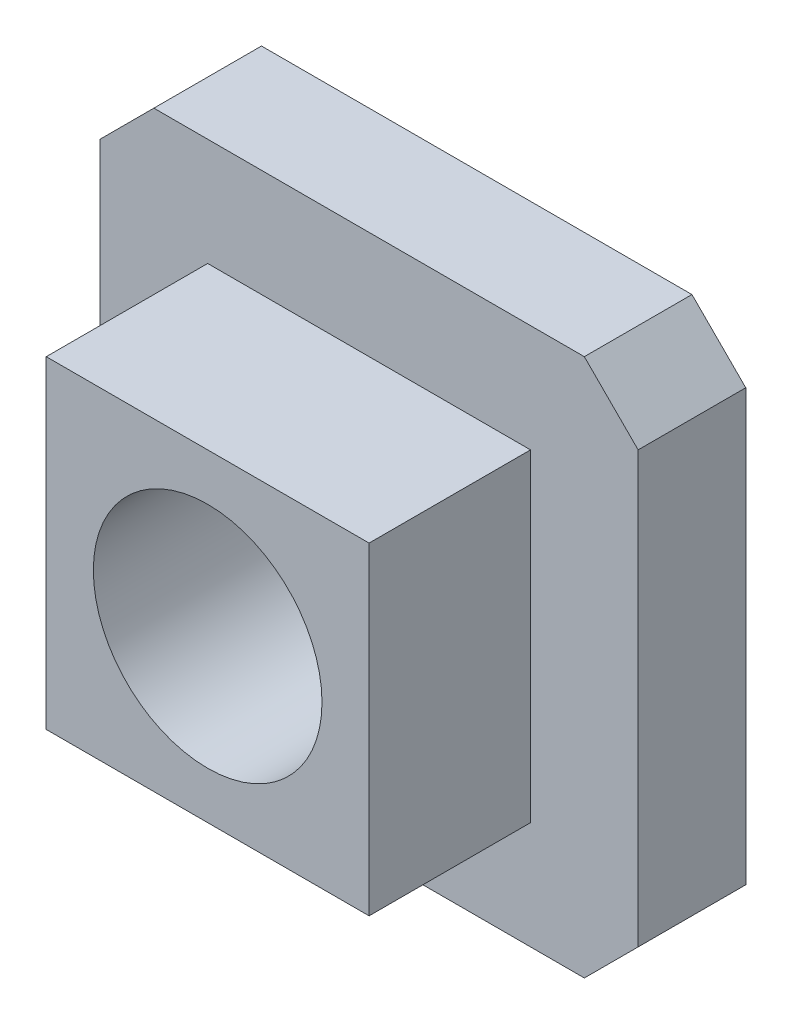
ISO-10303-21;
HEADER;
FILE_DESCRIPTION(('STEP AP214'),'2;1');
FILE_NAME('part.step','',(''),(''),'','','');
FILE_SCHEMA(('AUTOMOTIVE_DESIGN { 1 0 10303 214 1 1 1 1 }'));
ENDSEC;
DATA;
#1=APPLICATION_CONTEXT('core data for automotive mechanical design processes');
#2=APPLICATION_PROTOCOL_DEFINITION('international standard','automotive_design',2000,#1);
#3=PRODUCT_CONTEXT('',#1,'mechanical');
#4=PRODUCT('Part','Part','',(#3));
#5=PRODUCT_RELATED_PRODUCT_CATEGORY('part','',(#4));
#6=PRODUCT_DEFINITION_FORMATION('','',#4);
#7=PRODUCT_DEFINITION_CONTEXT('part definition',#1,'design');
#8=PRODUCT_DEFINITION('design','',#6,#7);
#9=PRODUCT_DEFINITION_SHAPE('','',#8);
#10=(LENGTH_UNIT() NAMED_UNIT(*) SI_UNIT(.MILLI.,.METRE.));
#11=(NAMED_UNIT(*) PLANE_ANGLE_UNIT() SI_UNIT($,.RADIAN.));
#12=(NAMED_UNIT(*) SI_UNIT($,.STERADIAN.) SOLID_ANGLE_UNIT());
#13=UNCERTAINTY_MEASURE_WITH_UNIT(LENGTH_MEASURE(1.E-05),#10,'distance_accuracy_value','');
#14=(GEOMETRIC_REPRESENTATION_CONTEXT(3) GLOBAL_UNCERTAINTY_ASSIGNED_CONTEXT((#13)) GLOBAL_UNIT_ASSIGNED_CONTEXT((#10,
#11,#12)) REPRESENTATION_CONTEXT('',''));
#15=CARTESIAN_POINT('',(0.,0.,0.));
#16=DIRECTION('',(0.,0.,1.));
#17=DIRECTION('',(1.,0.,0.));
#18=AXIS2_PLACEMENT_3D('',#15,#16,#17);
#19=CARTESIAN_POINT('',(0.,0.,3.175));
#20=DIRECTION('',(0.,0.,1.));
#21=DIRECTION('',(1.,0.,0.));
#22=AXIS2_PLACEMENT_3D('',#19,#20,#21);
#23=PLANE('',#22);
#24=DIRECTION('',(0.,1.,0.));
#25=VECTOR('',#24,1.);
#26=CARTESIAN_POINT('',(15.875,-15.875,3.175));
#27=LINE('',#26,#25);
#28=CARTESIAN_POINT('',(15.875,-12.7,3.175));
#29=VERTEX_POINT('',#28);
#30=CARTESIAN_POINT('',(15.875,12.7,3.175));
#31=VERTEX_POINT('',#30);
#32=EDGE_CURVE('E165',#29,#31,#27,.T.);
#33=ORIENTED_EDGE('',*,*,#32,.T.);
#34=DIRECTION('',(0.707106781186547,-0.707106781186548,0.));
#35=VECTOR('',#34,1.);
#36=CARTESIAN_POINT('',(14.2875,14.2875,3.175));
#37=LINE('',#36,#35);
#38=CARTESIAN_POINT('',(12.7,15.875,3.175));
#39=VERTEX_POINT('',#38);
#40=EDGE_CURVE('E200',#31,#39,#37,.F.);
#41=ORIENTED_EDGE('',*,*,#40,.T.);
#42=DIRECTION('',(-1.,0.,0.));
#43=VECTOR('',#42,1.);
#44=CARTESIAN_POINT('',(15.875,15.875,3.175));
#45=LINE('',#44,#43);
#46=CARTESIAN_POINT('',(-12.7,15.875,3.175));
#47=VERTEX_POINT('',#46);
#48=EDGE_CURVE('E168',#39,#47,#45,.T.);
#49=ORIENTED_EDGE('',*,*,#48,.T.);
#50=DIRECTION('',(0.707106781186548,0.707106781186547,0.));
#51=VECTOR('',#50,1.);
#52=CARTESIAN_POINT('',(-14.2875,14.2875,3.175));
#53=LINE('',#52,#51);
#54=CARTESIAN_POINT('',(-15.875,12.7,3.175));
#55=VERTEX_POINT('',#54);
#56=EDGE_CURVE('E198',#47,#55,#53,.F.);
#57=ORIENTED_EDGE('',*,*,#56,.T.);
#58=DIRECTION('',(0.,-1.,0.));
#59=VECTOR('',#58,1.);
#60=CARTESIAN_POINT('',(-15.875,-15.875,3.175));
#61=LINE('',#60,#59);
#62=CARTESIAN_POINT('',(-15.875,-12.7,3.175));
#63=VERTEX_POINT('',#62);
#64=EDGE_CURVE('E160',#55,#63,#61,.T.);
#65=ORIENTED_EDGE('',*,*,#64,.T.);
#66=DIRECTION('',(-0.707106781186546,0.707106781186549,0.));
#67=VECTOR('',#66,1.);
#68=CARTESIAN_POINT('',(-14.2875,-14.2875,3.175));
#69=LINE('',#68,#67);
#70=CARTESIAN_POINT('',(-12.7,-15.875,3.175));
#71=VERTEX_POINT('',#70);
#72=EDGE_CURVE('E57',#63,#71,#69,.F.);
#73=ORIENTED_EDGE('',*,*,#72,.T.);
#74=DIRECTION('',(1.,0.,0.));
#75=VECTOR('',#74,1.);
#76=CARTESIAN_POINT('',(15.875,-15.875,3.175));
#77=LINE('',#76,#75);
#78=CARTESIAN_POINT('',(12.7,-15.875,3.175));
#79=VERTEX_POINT('',#78);
#80=EDGE_CURVE('E162',#71,#79,#77,.T.);
#81=ORIENTED_EDGE('',*,*,#80,.T.);
#82=DIRECTION('',(-0.707106781186548,-0.707106781186547,0.));
#83=VECTOR('',#82,1.);
#84=CARTESIAN_POINT('',(14.2875,-14.2875,3.175));
#85=LINE('',#84,#83);
#86=EDGE_CURVE('E195',#79,#29,#85,.F.);
#87=ORIENTED_EDGE('',*,*,#86,.T.);
#88=EDGE_LOOP('',(#33,#41,#49,#57,#65,#73,#81,#87));
#89=FACE_BOUND('',#88,.T.);
#90=DIRECTION('',(1.,0.,0.));
#91=VECTOR('',#90,1.);
#92=CARTESIAN_POINT('',(9.525,-9.525,3.175));
#93=LINE('',#92,#91);
#94=CARTESIAN_POINT('',(-9.525,-9.525,3.175));
#95=VERTEX_POINT('',#94);
#96=CARTESIAN_POINT('',(9.525,-9.525,3.175));
#97=VERTEX_POINT('',#96);
#98=EDGE_CURVE('E390',#95,#97,#93,.T.);
#99=ORIENTED_EDGE('',*,*,#98,.F.);
#100=DIRECTION('',(0.,-1.,0.));
#101=VECTOR('',#100,1.);
#102=CARTESIAN_POINT('',(-9.525,-9.525,3.175));
#103=LINE('',#102,#101);
#104=CARTESIAN_POINT('',(-9.525,9.525,3.175));
#105=VERTEX_POINT('',#104);
#106=EDGE_CURVE('E149',#105,#95,#103,.T.);
#107=ORIENTED_EDGE('',*,*,#106,.F.);
#108=DIRECTION('',(-1.,0.,0.));
#109=VECTOR('',#108,1.);
#110=CARTESIAN_POINT('',(9.525,9.525,3.175));
#111=LINE('',#110,#109);
#112=CARTESIAN_POINT('',(9.525,9.525,3.175));
#113=VERTEX_POINT('',#112);
#114=EDGE_CURVE('E145',#113,#105,#111,.T.);
#115=ORIENTED_EDGE('',*,*,#114,.F.);
#116=DIRECTION('',(0.,1.,0.));
#117=VECTOR('',#116,1.);
#118=CARTESIAN_POINT('',(9.525,-9.525,3.175));
#119=LINE('',#118,#117);
#120=EDGE_CURVE('E392',#97,#113,#119,.T.);
#121=ORIENTED_EDGE('',*,*,#120,.F.);
#122=EDGE_LOOP('',(#99,#107,#115,#121));
#123=FACE_BOUND('',#122,.T.);
#124=ADVANCED_FACE('F36',(#89,#123),#23,.T.);
#125=CARTESIAN_POINT('',(-15.875,-15.875,3.175));
#126=DIRECTION('',(1.,0.,0.));
#127=DIRECTION('',(0.,0.,-1.));
#128=AXIS2_PLACEMENT_3D('',#125,#126,#127);
#129=PLANE('',#128);
#130=ORIENTED_EDGE('',*,*,#64,.F.);
#131=DIRECTION('',(0.,0.,-1.));
#132=VECTOR('',#131,1.);
#133=CARTESIAN_POINT('',(-15.875,12.7,3.175));
#134=LINE('',#133,#132);
#135=CARTESIAN_POINT('',(-15.875,12.7,-3.175));
#136=VERTEX_POINT('',#135);
#137=EDGE_CURVE('E204',#55,#136,#134,.T.);
#138=ORIENTED_EDGE('',*,*,#137,.T.);
#139=DIRECTION('',(0.,-1.,0.));
#140=VECTOR('',#139,1.);
#141=CARTESIAN_POINT('',(-15.875,-15.875,-3.175));
#142=LINE('',#141,#140);
#143=CARTESIAN_POINT('',(-15.875,-12.7,-3.175));
#144=VERTEX_POINT('',#143);
#145=EDGE_CURVE('E151',#136,#144,#142,.T.);
#146=ORIENTED_EDGE('',*,*,#145,.T.);
#147=DIRECTION('',(0.,0.,1.));
#148=VECTOR('',#147,1.);
#149=CARTESIAN_POINT('',(-15.875,-12.7,3.175));
#150=LINE('',#149,#148);
#151=EDGE_CURVE('E202',#144,#63,#150,.T.);
#152=ORIENTED_EDGE('',*,*,#151,.T.);
#153=EDGE_LOOP('',(#130,#138,#146,#152));
#154=FACE_BOUND('',#153,.T.);
#155=ADVANCED_FACE('F210',(#154),#129,.F.);
#156=CARTESIAN_POINT('',(15.875,-15.875,3.175));
#157=DIRECTION('',(0.,1.,0.));
#158=DIRECTION('',(-1.,0.,0.));
#159=AXIS2_PLACEMENT_3D('',#156,#157,#158);
#160=PLANE('',#159);
#161=ORIENTED_EDGE('',*,*,#80,.F.);
#162=DIRECTION('',(0.,0.,-1.));
#163=VECTOR('',#162,1.);
#164=CARTESIAN_POINT('',(-12.7,-15.875,3.175));
#165=LINE('',#164,#163);
#166=CARTESIAN_POINT('',(-12.7,-15.875,-3.175));
#167=VERTEX_POINT('',#166);
#168=EDGE_CURVE('E11',#71,#167,#165,.T.);
#169=ORIENTED_EDGE('',*,*,#168,.T.);
#170=DIRECTION('',(1.,0.,0.));
#171=VECTOR('',#170,1.);
#172=CARTESIAN_POINT('',(15.875,-15.875,-3.175));
#173=LINE('',#172,#171);
#174=CARTESIAN_POINT('',(12.7,-15.875,-3.175));
#175=VERTEX_POINT('',#174);
#176=EDGE_CURVE('E154',#167,#175,#173,.T.);
#177=ORIENTED_EDGE('',*,*,#176,.T.);
#178=DIRECTION('',(0.,0.,1.));
#179=VECTOR('',#178,1.);
#180=CARTESIAN_POINT('',(12.7,-15.875,3.175));
#181=LINE('',#180,#179);
#182=EDGE_CURVE('E44',#175,#79,#181,.T.);
#183=ORIENTED_EDGE('',*,*,#182,.T.);
#184=EDGE_LOOP('',(#161,#169,#177,#183));
#185=FACE_BOUND('',#184,.T.);
#186=ADVANCED_FACE('F221',(#185),#160,.F.);
#187=CARTESIAN_POINT('',(15.875,-15.875,3.175));
#188=DIRECTION('',(-1.,0.,0.));
#189=DIRECTION('',(0.,0.,1.));
#190=AXIS2_PLACEMENT_3D('',#187,#188,#189);
#191=PLANE('',#190);
#192=DIRECTION('',(0.,1.,0.));
#193=VECTOR('',#192,1.);
#194=CARTESIAN_POINT('',(15.875,-15.875,-3.175));
#195=LINE('',#194,#193);
#196=CARTESIAN_POINT('',(15.875,-12.7,-3.175));
#197=VERTEX_POINT('',#196);
#198=CARTESIAN_POINT('',(15.875,12.7,-3.175));
#199=VERTEX_POINT('',#198);
#200=EDGE_CURVE('E173',#197,#199,#195,.T.);
#201=ORIENTED_EDGE('',*,*,#200,.T.);
#202=DIRECTION('',(0.,0.,1.));
#203=VECTOR('',#202,1.);
#204=CARTESIAN_POINT('',(15.875,12.7,3.175));
#205=LINE('',#204,#203);
#206=EDGE_CURVE('E193',#199,#31,#205,.T.);
#207=ORIENTED_EDGE('',*,*,#206,.T.);
#208=ORIENTED_EDGE('',*,*,#32,.F.);
#209=DIRECTION('',(0.,0.,-1.));
#210=VECTOR('',#209,1.);
#211=CARTESIAN_POINT('',(15.875,-12.7,3.175));
#212=LINE('',#211,#210);
#213=EDGE_CURVE('E190',#29,#197,#212,.T.);
#214=ORIENTED_EDGE('',*,*,#213,.T.);
#215=EDGE_LOOP('',(#201,#207,#208,#214));
#216=FACE_BOUND('',#215,.T.);
#217=ADVANCED_FACE('F229',(#216),#191,.F.);
#218=CARTESIAN_POINT('',(15.875,15.875,3.175));
#219=DIRECTION('',(0.,-1.,0.));
#220=DIRECTION('',(1.,0.,0.));
#221=AXIS2_PLACEMENT_3D('',#218,#219,#220);
#222=PLANE('',#221);
#223=ORIENTED_EDGE('',*,*,#48,.F.);
#224=DIRECTION('',(0.,0.,-1.));
#225=VECTOR('',#224,1.);
#226=CARTESIAN_POINT('',(12.7,15.875,3.175));
#227=LINE('',#226,#225);
#228=CARTESIAN_POINT('',(12.7,15.875,-3.175));
#229=VERTEX_POINT('',#228);
#230=EDGE_CURVE('E179',#39,#229,#227,.T.);
#231=ORIENTED_EDGE('',*,*,#230,.T.);
#232=DIRECTION('',(-1.,0.,0.));
#233=VECTOR('',#232,1.);
#234=CARTESIAN_POINT('',(15.875,15.875,-3.175));
#235=LINE('',#234,#233);
#236=CARTESIAN_POINT('',(-12.7,15.875,-3.175));
#237=VERTEX_POINT('',#236);
#238=EDGE_CURVE('E163',#229,#237,#235,.T.);
#239=ORIENTED_EDGE('',*,*,#238,.T.);
#240=DIRECTION('',(0.,0.,1.));
#241=VECTOR('',#240,1.);
#242=CARTESIAN_POINT('',(-12.7,15.875,3.175));
#243=LINE('',#242,#241);
#244=EDGE_CURVE('E170',#237,#47,#243,.T.);
#245=ORIENTED_EDGE('',*,*,#244,.T.);
#246=EDGE_LOOP('',(#223,#231,#239,#245));
#247=FACE_BOUND('',#246,.T.);
#248=ADVANCED_FACE('F237',(#247),#222,.F.);
#249=CARTESIAN_POINT('',(0.,0.,-3.175));
#250=DIRECTION('',(0.,0.,1.));
#251=DIRECTION('',(1.,0.,0.));
#252=AXIS2_PLACEMENT_3D('',#249,#250,#251);
#253=PLANE('',#252);
#254=CARTESIAN_POINT('',(0.,0.,-3.175));
#255=DIRECTION('',(0.,0.,-1.));
#256=DIRECTION('',(-1.,0.,0.));
#257=AXIS2_PLACEMENT_3D('',#254,#255,#256);
#258=CIRCLE('',#257,6.74623999999999);
#259=CARTESIAN_POINT('',(-6.74623999999999,0.,-3.175));
#260=VERTEX_POINT('',#259);
#261=EDGE_CURVE('E382',#260,#260,#258,.T.);
#262=ORIENTED_EDGE('',*,*,#261,.F.);
#263=EDGE_LOOP('',(#262));
#264=FACE_BOUND('',#263,.T.);
#265=ORIENTED_EDGE('',*,*,#238,.F.);
#266=DIRECTION('',(-0.707106781186547,0.707106781186548,0.));
#267=VECTOR('',#266,1.);
#268=CARTESIAN_POINT('',(12.7,15.875,-3.175));
#269=LINE('',#268,#267);
#270=EDGE_CURVE('E188',#229,#199,#269,.F.);
#271=ORIENTED_EDGE('',*,*,#270,.T.);
#272=ORIENTED_EDGE('',*,*,#200,.F.);
#273=DIRECTION('',(0.707106781186548,0.707106781186547,0.));
#274=VECTOR('',#273,1.);
#275=CARTESIAN_POINT('',(15.875,-12.7,-3.175));
#276=LINE('',#275,#274);
#277=EDGE_CURVE('E182',#197,#175,#276,.F.);
#278=ORIENTED_EDGE('',*,*,#277,.T.);
#279=ORIENTED_EDGE('',*,*,#176,.F.);
#280=DIRECTION('',(0.707106781186546,-0.707106781186549,0.));
#281=VECTOR('',#280,1.);
#282=CARTESIAN_POINT('',(-12.7,-15.875,-3.175));
#283=LINE('',#282,#281);
#284=EDGE_CURVE('E184',#167,#144,#283,.F.);
#285=ORIENTED_EDGE('',*,*,#284,.T.);
#286=ORIENTED_EDGE('',*,*,#145,.F.);
#287=DIRECTION('',(-0.707106781186548,-0.707106781186547,0.));
#288=VECTOR('',#287,1.);
#289=CARTESIAN_POINT('',(-15.875,12.7,-3.175));
#290=LINE('',#289,#288);
#291=EDGE_CURVE('E186',#136,#237,#290,.F.);
#292=ORIENTED_EDGE('',*,*,#291,.T.);
#293=EDGE_LOOP('',(#265,#271,#272,#278,#279,#285,#286,#292));
#294=FACE_BOUND('',#293,.T.);
#295=ADVANCED_FACE('F216',(#264,#294),#253,.F.);
#296=CARTESIAN_POINT('',(-9.525,-9.525,12.7));
#297=DIRECTION('',(1.,0.,0.));
#298=DIRECTION('',(0.,0.,-1.));
#299=AXIS2_PLACEMENT_3D('',#296,#297,#298);
#300=PLANE('',#299);
#301=ORIENTED_EDGE('',*,*,#106,.T.);
#302=DIRECTION('',(0.,0.,-1.));
#303=VECTOR('',#302,1.);
#304=CARTESIAN_POINT('',(-9.525,-9.525,12.7));
#305=LINE('',#304,#303);
#306=CARTESIAN_POINT('',(-9.525,-9.525,12.7));
#307=VERTEX_POINT('',#306);
#308=EDGE_CURVE('E129',#307,#95,#305,.T.);
#309=ORIENTED_EDGE('',*,*,#308,.F.);
#310=DIRECTION('',(0.,-1.,0.));
#311=VECTOR('',#310,1.);
#312=CARTESIAN_POINT('',(-9.525,-9.525,12.7));
#313=LINE('',#312,#311);
#314=CARTESIAN_POINT('',(-9.525,9.525,12.7));
#315=VERTEX_POINT('',#314);
#316=EDGE_CURVE('E136',#315,#307,#313,.T.);
#317=ORIENTED_EDGE('',*,*,#316,.F.);
#318=DIRECTION('',(0.,0.,-1.));
#319=VECTOR('',#318,1.);
#320=CARTESIAN_POINT('',(-9.525,9.525,12.7));
#321=LINE('',#320,#319);
#322=EDGE_CURVE('E388',#315,#105,#321,.T.);
#323=ORIENTED_EDGE('',*,*,#322,.T.);
#324=EDGE_LOOP('',(#301,#309,#317,#323));
#325=FACE_BOUND('',#324,.T.);
#326=ADVANCED_FACE('F147',(#325),#300,.F.);
#327=CARTESIAN_POINT('',(9.525,-9.525,12.7));
#328=DIRECTION('',(0.,1.,0.));
#329=DIRECTION('',(-1.,0.,0.));
#330=AXIS2_PLACEMENT_3D('',#327,#328,#329);
#331=PLANE('',#330);
#332=ORIENTED_EDGE('',*,*,#98,.T.);
#333=DIRECTION('',(0.,0.,-1.));
#334=VECTOR('',#333,1.);
#335=CARTESIAN_POINT('',(9.525,-9.525,12.7));
#336=LINE('',#335,#334);
#337=CARTESIAN_POINT('',(9.525,-9.525,12.7));
#338=VERTEX_POINT('',#337);
#339=EDGE_CURVE('E132',#338,#97,#336,.T.);
#340=ORIENTED_EDGE('',*,*,#339,.F.);
#341=DIRECTION('',(1.,0.,0.));
#342=VECTOR('',#341,1.);
#343=CARTESIAN_POINT('',(9.525,-9.525,12.7));
#344=LINE('',#343,#342);
#345=EDGE_CURVE('E125',#307,#338,#344,.T.);
#346=ORIENTED_EDGE('',*,*,#345,.F.);
#347=ORIENTED_EDGE('',*,*,#308,.T.);
#348=EDGE_LOOP('',(#332,#340,#346,#347));
#349=FACE_BOUND('',#348,.T.);
#350=ADVANCED_FACE('F127',(#349),#331,.F.);
#351=CARTESIAN_POINT('',(9.525,-9.525,12.7));
#352=DIRECTION('',(-1.,0.,0.));
#353=DIRECTION('',(0.,0.,1.));
#354=AXIS2_PLACEMENT_3D('',#351,#352,#353);
#355=PLANE('',#354);
#356=ORIENTED_EDGE('',*,*,#120,.T.);
#357=DIRECTION('',(0.,0.,-1.));
#358=VECTOR('',#357,1.);
#359=CARTESIAN_POINT('',(9.525,9.525,12.7));
#360=LINE('',#359,#358);
#361=CARTESIAN_POINT('',(9.525,9.525,12.7));
#362=VERTEX_POINT('',#361);
#363=EDGE_CURVE('E156',#362,#113,#360,.T.);
#364=ORIENTED_EDGE('',*,*,#363,.F.);
#365=DIRECTION('',(0.,1.,0.));
#366=VECTOR('',#365,1.);
#367=CARTESIAN_POINT('',(9.525,-9.525,12.7));
#368=LINE('',#367,#366);
#369=EDGE_CURVE('E135',#338,#362,#368,.T.);
#370=ORIENTED_EDGE('',*,*,#369,.F.);
#371=ORIENTED_EDGE('',*,*,#339,.T.);
#372=EDGE_LOOP('',(#356,#364,#370,#371));
#373=FACE_BOUND('',#372,.T.);
#374=ADVANCED_FACE('F293',(#373),#355,.F.);
#375=CARTESIAN_POINT('',(9.525,9.525,12.7));
#376=DIRECTION('',(0.,-1.,0.));
#377=DIRECTION('',(1.,0.,0.));
#378=AXIS2_PLACEMENT_3D('',#375,#376,#377);
#379=PLANE('',#378);
#380=ORIENTED_EDGE('',*,*,#114,.T.);
#381=ORIENTED_EDGE('',*,*,#322,.F.);
#382=DIRECTION('',(-1.,0.,0.));
#383=VECTOR('',#382,1.);
#384=CARTESIAN_POINT('',(9.525,9.525,12.7));
#385=LINE('',#384,#383);
#386=EDGE_CURVE('E141',#362,#315,#385,.T.);
#387=ORIENTED_EDGE('',*,*,#386,.F.);
#388=ORIENTED_EDGE('',*,*,#363,.T.);
#389=EDGE_LOOP('',(#380,#381,#387,#388));
#390=FACE_BOUND('',#389,.T.);
#391=ADVANCED_FACE('F299',(#390),#379,.F.);
#392=CARTESIAN_POINT('',(0.,0.,12.7));
#393=DIRECTION('',(0.,0.,1.));
#394=DIRECTION('',(1.,0.,0.));
#395=AXIS2_PLACEMENT_3D('',#392,#393,#394);
#396=PLANE('',#395);
#397=CARTESIAN_POINT('',(0.,0.,12.7));
#398=DIRECTION('',(0.,0.,-1.));
#399=DIRECTION('',(-1.,0.,0.));
#400=AXIS2_PLACEMENT_3D('',#397,#398,#399);
#401=CIRCLE('',#400,6.74624);
#402=CARTESIAN_POINT('',(-6.74624,0.,12.7));
#403=VERTEX_POINT('',#402);
#404=EDGE_CURVE('E379',#403,#403,#401,.T.);
#405=ORIENTED_EDGE('',*,*,#404,.T.);
#406=EDGE_LOOP('',(#405));
#407=FACE_BOUND('',#406,.T.);
#408=ORIENTED_EDGE('',*,*,#316,.T.);
#409=ORIENTED_EDGE('',*,*,#345,.T.);
#410=ORIENTED_EDGE('',*,*,#369,.T.);
#411=ORIENTED_EDGE('',*,*,#386,.T.);
#412=EDGE_LOOP('',(#408,#409,#410,#411));
#413=FACE_BOUND('',#412,.T.);
#414=ADVANCED_FACE('F139',(#407,#413),#396,.T.);
#415=CARTESIAN_POINT('',(0.,0.,-3.175));
#416=DIRECTION('',(0.,0.,-1.));
#417=DIRECTION('',(-1.,0.,0.));
#418=AXIS2_PLACEMENT_3D('',#415,#416,#417);
#419=CYLINDRICAL_SURFACE('',#418,6.74623999999999);
#420=ORIENTED_EDGE('',*,*,#404,.F.);
#421=EDGE_LOOP('',(#420));
#422=FACE_BOUND('',#421,.T.);
#423=ORIENTED_EDGE('',*,*,#261,.T.);
#424=EDGE_LOOP('',(#423));
#425=FACE_BOUND('',#424,.T.);
#426=ADVANCED_FACE('F246',(#422,#425),#419,.F.);
#427=CARTESIAN_POINT('',(12.7,15.875,3.175));
#428=DIRECTION('',(-0.707106781186548,-0.707106781186547,0.));
#429=DIRECTION('',(0.,0.,-1.));
#430=AXIS2_PLACEMENT_3D('',#427,#428,#429);
#431=PLANE('',#430);
#432=ORIENTED_EDGE('',*,*,#40,.F.);
#433=ORIENTED_EDGE('',*,*,#206,.F.);
#434=ORIENTED_EDGE('',*,*,#270,.F.);
#435=ORIENTED_EDGE('',*,*,#230,.F.);
#436=EDGE_LOOP('',(#432,#433,#434,#435));
#437=FACE_BOUND('',#436,.T.);
#438=ADVANCED_FACE('F234',(#437),#431,.F.);
#439=CARTESIAN_POINT('',(-15.875,12.7,3.175));
#440=DIRECTION('',(0.707106781186547,-0.707106781186548,0.));
#441=DIRECTION('',(0.,0.,-1.));
#442=AXIS2_PLACEMENT_3D('',#439,#440,#441);
#443=PLANE('',#442);
#444=ORIENTED_EDGE('',*,*,#56,.F.);
#445=ORIENTED_EDGE('',*,*,#244,.F.);
#446=ORIENTED_EDGE('',*,*,#291,.F.);
#447=ORIENTED_EDGE('',*,*,#137,.F.);
#448=EDGE_LOOP('',(#444,#445,#446,#447));
#449=FACE_BOUND('',#448,.T.);
#450=ADVANCED_FACE('F239',(#449),#443,.F.);
#451=CARTESIAN_POINT('',(-12.7,-15.875,3.175));
#452=DIRECTION('',(0.707106781186549,0.707106781186546,0.));
#453=DIRECTION('',(0.,0.,-1.));
#454=AXIS2_PLACEMENT_3D('',#451,#452,#453);
#455=PLANE('',#454);
#456=ORIENTED_EDGE('',*,*,#72,.F.);
#457=ORIENTED_EDGE('',*,*,#151,.F.);
#458=ORIENTED_EDGE('',*,*,#284,.F.);
#459=ORIENTED_EDGE('',*,*,#168,.F.);
#460=EDGE_LOOP('',(#456,#457,#458,#459));
#461=FACE_BOUND('',#460,.T.);
#462=ADVANCED_FACE('F220',(#461),#455,.F.);
#463=CARTESIAN_POINT('',(15.875,-12.7,3.175));
#464=DIRECTION('',(-0.707106781186547,0.707106781186548,0.));
#465=DIRECTION('',(0.,0.,-1.));
#466=AXIS2_PLACEMENT_3D('',#463,#464,#465);
#467=PLANE('',#466);
#468=ORIENTED_EDGE('',*,*,#86,.F.);
#469=ORIENTED_EDGE('',*,*,#182,.F.);
#470=ORIENTED_EDGE('',*,*,#277,.F.);
#471=ORIENTED_EDGE('',*,*,#213,.F.);
#472=EDGE_LOOP('',(#468,#469,#470,#471));
#473=FACE_BOUND('',#472,.T.);
#474=ADVANCED_FACE('F38',(#473),#467,.F.);
#475=CLOSED_SHELL('',(#124,#155,#186,#217,#248,#295,#326,#350,#374,#391,#414,#426,#438,#450,
#462,#474));
#476=MANIFOLD_SOLID_BREP('B2',#475);
#477=ADVANCED_BREP_SHAPE_REPRESENTATION('',(#18,#476),#14);
#478=SHAPE_DEFINITION_REPRESENTATION(#9,#477);
ENDSEC;
END-ISO-10303-21;
